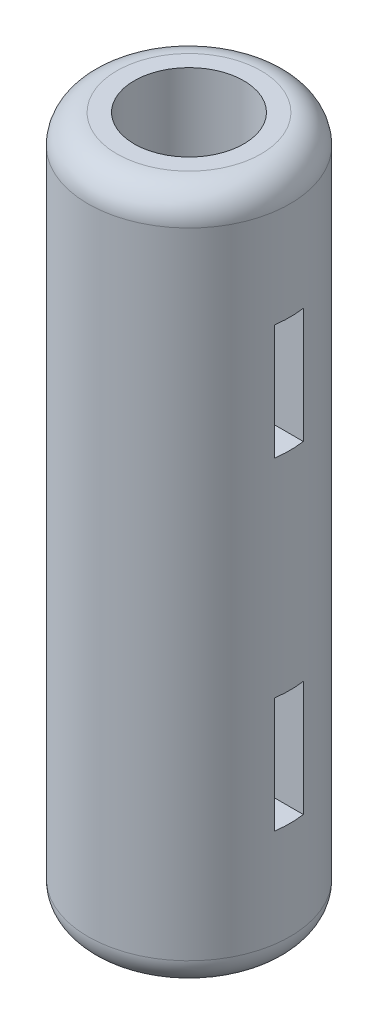
ISO-10303-21;
HEADER;
FILE_DESCRIPTION(('STEP AP214'),'2;1');
FILE_NAME('part.step','',(''),(''),'','','');
FILE_SCHEMA(('AUTOMOTIVE_DESIGN { 1 0 10303 214 1 1 1 1 }'));
ENDSEC;
DATA;
#1=APPLICATION_CONTEXT('core data for automotive mechanical design processes');
#2=APPLICATION_PROTOCOL_DEFINITION('international standard','automotive_design',2000,#1);
#3=PRODUCT_CONTEXT('',#1,'mechanical');
#4=PRODUCT('Part','Part','',(#3));
#5=PRODUCT_RELATED_PRODUCT_CATEGORY('part','',(#4));
#6=PRODUCT_DEFINITION_FORMATION('','',#4);
#7=PRODUCT_DEFINITION_CONTEXT('part definition',#1,'design');
#8=PRODUCT_DEFINITION('design','',#6,#7);
#9=PRODUCT_DEFINITION_SHAPE('','',#8);
#10=(LENGTH_UNIT() NAMED_UNIT(*) SI_UNIT(.MILLI.,.METRE.));
#11=(NAMED_UNIT(*) PLANE_ANGLE_UNIT() SI_UNIT($,.RADIAN.));
#12=(NAMED_UNIT(*) SI_UNIT($,.STERADIAN.) SOLID_ANGLE_UNIT());
#13=UNCERTAINTY_MEASURE_WITH_UNIT(LENGTH_MEASURE(1.E-05),#10,'distance_accuracy_value','');
#14=(GEOMETRIC_REPRESENTATION_CONTEXT(3) GLOBAL_UNCERTAINTY_ASSIGNED_CONTEXT((#13)) GLOBAL_UNIT_ASSIGNED_CONTEXT((#10,
#11,#12)) REPRESENTATION_CONTEXT('',''));
#15=CARTESIAN_POINT('',(0.,0.,0.));
#16=DIRECTION('',(0.,0.,1.));
#17=DIRECTION('',(1.,0.,0.));
#18=AXIS2_PLACEMENT_3D('',#15,#16,#17);
#19=CARTESIAN_POINT('',(0.,240.,0.));
#20=DIRECTION('',(0.,-1.,0.));
#21=DIRECTION('',(0.,0.,-1.));
#22=AXIS2_PLACEMENT_3D('',#19,#20,#21);
#23=CYLINDRICAL_SURFACE('',#22,35.);
#24=CARTESIAN_POINT('',(0.,10.,0.));
#25=DIRECTION('',(0.,1.,0.));
#26=DIRECTION('',(0.,0.,1.));
#27=AXIS2_PLACEMENT_3D('',#24,#25,#26);
#28=CIRCLE('',#27,35.);
#29=CARTESIAN_POINT('',(0.,10.,35.));
#30=VERTEX_POINT('',#29);
#31=EDGE_CURVE('E48',#30,#30,#28,.T.);
#32=ORIENTED_EDGE('',*,*,#31,.T.);
#33=EDGE_LOOP('',(#32));
#34=FACE_BOUND('',#33,.T.);
#35=CARTESIAN_POINT('',(0.,230.,0.));
#36=DIRECTION('',(0.,1.,0.));
#37=DIRECTION('',(0.,0.,1.));
#38=AXIS2_PLACEMENT_3D('',#35,#36,#37);
#39=CIRCLE('',#38,35.);
#40=CARTESIAN_POINT('',(0.,230.,35.));
#41=VERTEX_POINT('',#40);
#42=EDGE_CURVE('E196',#41,#41,#39,.F.);
#43=ORIENTED_EDGE('',*,*,#42,.T.);
#44=EDGE_LOOP('',(#43));
#45=FACE_BOUND('',#44,.T.);
#46=DIRECTION('',(0.,-1.,0.));
#47=VECTOR('',#46,1.);
#48=CARTESIAN_POINT('',(-34.6410161513776,240.,-4.99999999999993));
#49=LINE('',#48,#47);
#50=CARTESIAN_POINT('',(-34.6410161513776,44.,-4.99999999999999));
#51=VERTEX_POINT('',#50);
#52=CARTESIAN_POINT('',(-34.6410161513776,84.,-4.99999999999998));
#53=VERTEX_POINT('',#52);
#54=EDGE_CURVE('E294',#51,#53,#49,.F.);
#55=ORIENTED_EDGE('',*,*,#54,.T.);
#56=CARTESIAN_POINT('',(0.,84.,0.));
#57=DIRECTION('',(0.,1.,0.));
#58=DIRECTION('',(0.,0.,1.));
#59=AXIS2_PLACEMENT_3D('',#56,#57,#58);
#60=CIRCLE('',#59,35.);
#61=CARTESIAN_POINT('',(-34.6410161513776,84.,5.00000000000002));
#62=VERTEX_POINT('',#61);
#63=EDGE_CURVE('E55',#53,#62,#60,.T.);
#64=ORIENTED_EDGE('',*,*,#63,.T.);
#65=DIRECTION('',(0.,-1.,0.));
#66=VECTOR('',#65,1.);
#67=CARTESIAN_POINT('',(-34.6410161513775,240.,5.00000000000007));
#68=LINE('',#67,#66);
#69=CARTESIAN_POINT('',(-34.6410161513775,44.,5.00000000000001));
#70=VERTEX_POINT('',#69);
#71=EDGE_CURVE('E173',#62,#70,#68,.T.);
#72=ORIENTED_EDGE('',*,*,#71,.T.);
#73=CARTESIAN_POINT('',(0.,44.,0.));
#74=DIRECTION('',(0.,-1.,0.));
#75=DIRECTION('',(0.,0.,-1.));
#76=AXIS2_PLACEMENT_3D('',#73,#74,#75);
#77=CIRCLE('',#76,35.);
#78=EDGE_CURVE('E277',#70,#51,#77,.T.);
#79=ORIENTED_EDGE('',*,*,#78,.T.);
#80=EDGE_LOOP('',(#55,#64,#72,#79));
#81=FACE_BOUND('',#80,.T.);
#82=DIRECTION('',(0.,-1.,0.));
#83=VECTOR('',#82,1.);
#84=CARTESIAN_POINT('',(34.6410161513775,240.,5.00000000000007));
#85=LINE('',#84,#83);
#86=CARTESIAN_POINT('',(34.6410161513775,44.,5.00000000000001));
#87=VERTEX_POINT('',#86);
#88=CARTESIAN_POINT('',(34.6410161513776,84.,5.00000000000002));
#89=VERTEX_POINT('',#88);
#90=EDGE_CURVE('E289',#87,#89,#85,.F.);
#91=ORIENTED_EDGE('',*,*,#90,.T.);
#92=CARTESIAN_POINT('',(34.6410161513776,84.,-4.99999999999998));
#93=VERTEX_POINT('',#92);
#94=EDGE_CURVE('E63',#89,#93,#60,.T.);
#95=ORIENTED_EDGE('',*,*,#94,.T.);
#96=DIRECTION('',(0.,-1.,0.));
#97=VECTOR('',#96,1.);
#98=CARTESIAN_POINT('',(34.6410161513776,240.,-4.99999999999993));
#99=LINE('',#98,#97);
#100=CARTESIAN_POINT('',(34.6410161513776,44.,-4.99999999999999));
#101=VERTEX_POINT('',#100);
#102=EDGE_CURVE('E296',#93,#101,#99,.T.);
#103=ORIENTED_EDGE('',*,*,#102,.T.);
#104=EDGE_CURVE('E292',#101,#87,#77,.T.);
#105=ORIENTED_EDGE('',*,*,#104,.T.);
#106=EDGE_LOOP('',(#91,#95,#103,#105));
#107=FACE_BOUND('',#106,.T.);
#108=DIRECTION('',(0.,-1.,0.));
#109=VECTOR('',#108,1.);
#110=CARTESIAN_POINT('',(-34.6410161513776,240.,4.99999999999999));
#111=LINE('',#110,#109);
#112=CARTESIAN_POINT('',(-34.6410161513776,156.,4.99999999999999));
#113=VERTEX_POINT('',#112);
#114=CARTESIAN_POINT('',(-34.6410161513776,196.,4.99999999999999));
#115=VERTEX_POINT('',#114);
#116=EDGE_CURVE('E322',#113,#115,#111,.F.);
#117=ORIENTED_EDGE('',*,*,#116,.F.);
#118=CARTESIAN_POINT('',(0.,156.,0.));
#119=DIRECTION('',(0.,-1.,0.));
#120=DIRECTION('',(0.,0.,-1.));
#121=AXIS2_PLACEMENT_3D('',#118,#119,#120);
#122=CIRCLE('',#121,35.);
#123=CARTESIAN_POINT('',(-34.6410161513776,156.,-5.00000000000001));
#124=VERTEX_POINT('',#123);
#125=EDGE_CURVE('E327',#113,#124,#122,.T.);
#126=ORIENTED_EDGE('',*,*,#125,.T.);
#127=DIRECTION('',(0.,-1.,0.));
#128=VECTOR('',#127,1.);
#129=CARTESIAN_POINT('',(-34.6410161513776,240.,-5.00000000000001));
#130=LINE('',#129,#128);
#131=CARTESIAN_POINT('',(-34.6410161513776,196.,-5.00000000000001));
#132=VERTEX_POINT('',#131);
#133=EDGE_CURVE('E313',#124,#132,#130,.F.);
#134=ORIENTED_EDGE('',*,*,#133,.T.);
#135=CARTESIAN_POINT('',(0.,196.,0.));
#136=DIRECTION('',(0.,-1.,0.));
#137=DIRECTION('',(0.,0.,-1.));
#138=AXIS2_PLACEMENT_3D('',#135,#136,#137);
#139=CIRCLE('',#138,35.);
#140=EDGE_CURVE('E319',#115,#132,#139,.T.);
#141=ORIENTED_EDGE('',*,*,#140,.F.);
#142=EDGE_LOOP('',(#117,#126,#134,#141));
#143=FACE_BOUND('',#142,.T.);
#144=CARTESIAN_POINT('',(34.6410161513776,196.,-5.00000000000001));
#145=VERTEX_POINT('',#144);
#146=CARTESIAN_POINT('',(34.6410161513776,196.,4.99999999999999));
#147=VERTEX_POINT('',#146);
#148=EDGE_CURVE('E320',#145,#147,#139,.T.);
#149=ORIENTED_EDGE('',*,*,#148,.F.);
#150=DIRECTION('',(0.,-1.,0.));
#151=VECTOR('',#150,1.);
#152=CARTESIAN_POINT('',(34.6410161513776,240.,-5.00000000000001));
#153=LINE('',#152,#151);
#154=CARTESIAN_POINT('',(34.6410161513776,156.,-5.00000000000001));
#155=VERTEX_POINT('',#154);
#156=EDGE_CURVE('E316',#145,#155,#153,.T.);
#157=ORIENTED_EDGE('',*,*,#156,.T.);
#158=CARTESIAN_POINT('',(34.6410161513776,156.,4.99999999999999));
#159=VERTEX_POINT('',#158);
#160=EDGE_CURVE('E328',#155,#159,#122,.T.);
#161=ORIENTED_EDGE('',*,*,#160,.T.);
#162=DIRECTION('',(0.,-1.,0.));
#163=VECTOR('',#162,1.);
#164=CARTESIAN_POINT('',(34.6410161513776,240.,4.99999999999999));
#165=LINE('',#164,#163);
#166=EDGE_CURVE('E324',#147,#159,#165,.T.);
#167=ORIENTED_EDGE('',*,*,#166,.F.);
#168=EDGE_LOOP('',(#149,#157,#161,#167));
#169=FACE_BOUND('',#168,.T.);
#170=ADVANCED_FACE('F40',(#34,#45,#81,#107,#143,#169),#23,.T.);
#171=CARTESIAN_POINT('',(0.,240.,0.));
#172=DIRECTION('',(0.,1.,0.));
#173=DIRECTION('',(0.,0.,1.));
#174=AXIS2_PLACEMENT_3D('',#171,#172,#173);
#175=PLANE('',#174);
#176=CARTESIAN_POINT('',(0.,240.,0.));
#177=DIRECTION('',(0.,1.,0.));
#178=DIRECTION('',(0.,0.,1.));
#179=AXIS2_PLACEMENT_3D('',#176,#177,#178);
#180=CIRCLE('',#179,25.);
#181=CARTESIAN_POINT('',(0.,240.,25.));
#182=VERTEX_POINT('',#181);
#183=EDGE_CURVE('E193',#182,#182,#180,.T.);
#184=ORIENTED_EDGE('',*,*,#183,.T.);
#185=EDGE_LOOP('',(#184));
#186=FACE_BOUND('',#185,.T.);
#187=CARTESIAN_POINT('',(0.,240.,0.));
#188=DIRECTION('',(0.,1.,0.));
#189=DIRECTION('',(0.,0.,1.));
#190=AXIS2_PLACEMENT_3D('',#187,#188,#189);
#191=CIRCLE('',#190,19.);
#192=CARTESIAN_POINT('',(0.,240.,19.));
#193=VERTEX_POINT('',#192);
#194=EDGE_CURVE('E331',#193,#193,#191,.T.);
#195=ORIENTED_EDGE('',*,*,#194,.F.);
#196=EDGE_LOOP('',(#195));
#197=FACE_BOUND('',#196,.T.);
#198=ADVANCED_FACE('F214',(#186,#197),#175,.T.);
#199=CARTESIAN_POINT('',(0.,0.,0.));
#200=DIRECTION('',(0.,1.,0.));
#201=DIRECTION('',(0.,0.,1.));
#202=AXIS2_PLACEMENT_3D('',#199,#200,#201);
#203=PLANE('',#202);
#204=CARTESIAN_POINT('',(0.,0.,0.));
#205=DIRECTION('',(0.,1.,0.));
#206=DIRECTION('',(0.,0.,1.));
#207=AXIS2_PLACEMENT_3D('',#204,#205,#206);
#208=CIRCLE('',#207,25.);
#209=CARTESIAN_POINT('',(0.,0.,25.));
#210=VERTEX_POINT('',#209);
#211=EDGE_CURVE('E12',#210,#210,#208,.F.);
#212=ORIENTED_EDGE('',*,*,#211,.T.);
#213=EDGE_LOOP('',(#212));
#214=FACE_BOUND('',#213,.T.);
#215=CARTESIAN_POINT('',(0.,0.,0.));
#216=DIRECTION('',(0.,1.,0.));
#217=DIRECTION('',(0.,0.,1.));
#218=AXIS2_PLACEMENT_3D('',#215,#216,#217);
#219=CIRCLE('',#218,19.);
#220=CARTESIAN_POINT('',(0.,0.,19.));
#221=VERTEX_POINT('',#220);
#222=EDGE_CURVE('E330',#221,#221,#219,.T.);
#223=ORIENTED_EDGE('',*,*,#222,.T.);
#224=EDGE_LOOP('',(#223));
#225=FACE_BOUND('',#224,.T.);
#226=ADVANCED_FACE('F219',(#214,#225),#203,.F.);
#227=CARTESIAN_POINT('',(0.,240.,0.));
#228=DIRECTION('',(0.,-1.,0.));
#229=DIRECTION('',(0.,0.,-1.));
#230=AXIS2_PLACEMENT_3D('',#227,#228,#229);
#231=CYLINDRICAL_SURFACE('',#230,19.);
#232=DIRECTION('',(0.,-1.,0.));
#233=VECTOR('',#232,1.);
#234=CARTESIAN_POINT('',(18.3303027798234,240.,-4.99999999999993));
#235=LINE('',#234,#233);
#236=CARTESIAN_POINT('',(18.3303027798234,84.,-4.99999999999998));
#237=VERTEX_POINT('',#236);
#238=CARTESIAN_POINT('',(18.3303027798234,44.,-4.99999999999999));
#239=VERTEX_POINT('',#238);
#240=EDGE_CURVE('E191',#237,#239,#235,.T.);
#241=ORIENTED_EDGE('',*,*,#240,.F.);
#242=CARTESIAN_POINT('',(0.,84.,0.));
#243=DIRECTION('',(0.,1.,0.));
#244=DIRECTION('',(0.,0.,1.));
#245=AXIS2_PLACEMENT_3D('',#242,#243,#244);
#246=CIRCLE('',#245,19.);
#247=CARTESIAN_POINT('',(18.3303027798234,84.,5.00000000000002));
#248=VERTEX_POINT('',#247);
#249=EDGE_CURVE('E168',#248,#237,#246,.T.);
#250=ORIENTED_EDGE('',*,*,#249,.F.);
#251=DIRECTION('',(0.,-1.,0.));
#252=VECTOR('',#251,1.);
#253=CARTESIAN_POINT('',(18.3303027798233,240.,5.00000000000007));
#254=LINE('',#253,#252);
#255=CARTESIAN_POINT('',(18.3303027798233,44.,5.00000000000001));
#256=VERTEX_POINT('',#255);
#257=EDGE_CURVE('E188',#256,#248,#254,.F.);
#258=ORIENTED_EDGE('',*,*,#257,.F.);
#259=CARTESIAN_POINT('',(0.,44.,0.));
#260=DIRECTION('',(0.,-1.,0.));
#261=DIRECTION('',(0.,0.,-1.));
#262=AXIS2_PLACEMENT_3D('',#259,#260,#261);
#263=CIRCLE('',#262,19.);
#264=EDGE_CURVE('E184',#239,#256,#263,.T.);
#265=ORIENTED_EDGE('',*,*,#264,.F.);
#266=EDGE_LOOP('',(#241,#250,#258,#265));
#267=FACE_BOUND('',#266,.T.);
#268=DIRECTION('',(0.,-1.,0.));
#269=VECTOR('',#268,1.);
#270=CARTESIAN_POINT('',(-18.3303027798234,240.,-4.99999999999993));
#271=LINE('',#270,#269);
#272=CARTESIAN_POINT('',(-18.3303027798234,44.,-4.99999999999999));
#273=VERTEX_POINT('',#272);
#274=CARTESIAN_POINT('',(-18.3303027798234,84.,-4.99999999999998));
#275=VERTEX_POINT('',#274);
#276=EDGE_CURVE('E182',#273,#275,#271,.F.);
#277=ORIENTED_EDGE('',*,*,#276,.F.);
#278=CARTESIAN_POINT('',(-18.3303027798233,44.,5.00000000000001));
#279=VERTEX_POINT('',#278);
#280=EDGE_CURVE('E180',#279,#273,#263,.T.);
#281=ORIENTED_EDGE('',*,*,#280,.F.);
#282=DIRECTION('',(0.,-1.,0.));
#283=VECTOR('',#282,1.);
#284=CARTESIAN_POINT('',(-18.3303027798233,240.,5.00000000000007));
#285=LINE('',#284,#283);
#286=CARTESIAN_POINT('',(-18.3303027798234,84.,5.00000000000002));
#287=VERTEX_POINT('',#286);
#288=EDGE_CURVE('E165',#287,#279,#285,.T.);
#289=ORIENTED_EDGE('',*,*,#288,.F.);
#290=EDGE_CURVE('E154',#275,#287,#246,.T.);
#291=ORIENTED_EDGE('',*,*,#290,.F.);
#292=EDGE_LOOP('',(#277,#281,#289,#291));
#293=FACE_BOUND('',#292,.T.);
#294=CARTESIAN_POINT('',(0.,156.,0.));
#295=DIRECTION('',(0.,-1.,0.));
#296=DIRECTION('',(0.,0.,-1.));
#297=AXIS2_PLACEMENT_3D('',#294,#295,#296);
#298=CIRCLE('',#297,19.);
#299=CARTESIAN_POINT('',(18.3303027798234,156.,-5.00000000000001));
#300=VERTEX_POINT('',#299);
#301=CARTESIAN_POINT('',(18.3303027798234,156.,4.99999999999999));
#302=VERTEX_POINT('',#301);
#303=EDGE_CURVE('E166',#300,#302,#298,.T.);
#304=ORIENTED_EDGE('',*,*,#303,.F.);
#305=DIRECTION('',(0.,-1.,0.));
#306=VECTOR('',#305,1.);
#307=CARTESIAN_POINT('',(18.3303027798234,240.,-5.00000000000001));
#308=LINE('',#307,#306);
#309=CARTESIAN_POINT('',(18.3303027798234,196.,-5.00000000000001));
#310=VERTEX_POINT('',#309);
#311=EDGE_CURVE('E348',#310,#300,#308,.T.);
#312=ORIENTED_EDGE('',*,*,#311,.F.);
#313=CARTESIAN_POINT('',(0.,196.,0.));
#314=DIRECTION('',(0.,-1.,0.));
#315=DIRECTION('',(0.,0.,-1.));
#316=AXIS2_PLACEMENT_3D('',#313,#314,#315);
#317=CIRCLE('',#316,19.);
#318=CARTESIAN_POINT('',(18.3303027798234,196.,4.99999999999999));
#319=VERTEX_POINT('',#318);
#320=EDGE_CURVE('E342',#310,#319,#317,.T.);
#321=ORIENTED_EDGE('',*,*,#320,.T.);
#322=DIRECTION('',(0.,-1.,0.));
#323=VECTOR('',#322,1.);
#324=CARTESIAN_POINT('',(18.3303027798234,240.,4.99999999999999));
#325=LINE('',#324,#323);
#326=EDGE_CURVE('E349',#319,#302,#325,.T.);
#327=ORIENTED_EDGE('',*,*,#326,.T.);
#328=EDGE_LOOP('',(#304,#312,#321,#327));
#329=FACE_BOUND('',#328,.T.);
#330=CARTESIAN_POINT('',(-18.3303027798234,156.,4.99999999999999));
#331=VERTEX_POINT('',#330);
#332=CARTESIAN_POINT('',(-18.3303027798234,156.,-5.00000000000001));
#333=VERTEX_POINT('',#332);
#334=EDGE_CURVE('E345',#331,#333,#298,.T.);
#335=ORIENTED_EDGE('',*,*,#334,.F.);
#336=DIRECTION('',(0.,-1.,0.));
#337=VECTOR('',#336,1.);
#338=CARTESIAN_POINT('',(-18.3303027798234,240.,4.99999999999999));
#339=LINE('',#338,#337);
#340=CARTESIAN_POINT('',(-18.3303027798234,196.,4.99999999999999));
#341=VERTEX_POINT('',#340);
#342=EDGE_CURVE('E341',#331,#341,#339,.F.);
#343=ORIENTED_EDGE('',*,*,#342,.T.);
#344=CARTESIAN_POINT('',(-18.3303027798234,196.,-5.00000000000001));
#345=VERTEX_POINT('',#344);
#346=EDGE_CURVE('E338',#341,#345,#317,.T.);
#347=ORIENTED_EDGE('',*,*,#346,.T.);
#348=DIRECTION('',(0.,-1.,0.));
#349=VECTOR('',#348,1.);
#350=CARTESIAN_POINT('',(-18.3303027798234,240.,-5.00000000000001));
#351=LINE('',#350,#349);
#352=EDGE_CURVE('E334',#333,#345,#351,.F.);
#353=ORIENTED_EDGE('',*,*,#352,.F.);
#354=EDGE_LOOP('',(#335,#343,#347,#353));
#355=FACE_BOUND('',#354,.T.);
#356=ORIENTED_EDGE('',*,*,#194,.T.);
#357=EDGE_LOOP('',(#356));
#358=FACE_BOUND('',#357,.T.);
#359=ORIENTED_EDGE('',*,*,#222,.F.);
#360=EDGE_LOOP('',(#359));
#361=FACE_BOUND('',#360,.T.);
#362=ADVANCED_FACE('F178',(#267,#293,#329,#355,#358,#361),#231,.F.);
#363=CARTESIAN_POINT('',(-35.,156.,-5.00000000000001));
#364=DIRECTION('',(0.,0.,-1.));
#365=DIRECTION('',(-1.,0.,0.));
#366=AXIS2_PLACEMENT_3D('',#363,#364,#365);
#367=PLANE('',#366);
#368=DIRECTION('',(1.,0.,0.));
#369=VECTOR('',#368,1.);
#370=CARTESIAN_POINT('',(-35.,156.,-5.00000000000001));
#371=LINE('',#370,#369);
#372=EDGE_CURVE('E311',#124,#333,#371,.T.);
#373=ORIENTED_EDGE('',*,*,#372,.T.);
#374=ORIENTED_EDGE('',*,*,#352,.T.);
#375=DIRECTION('',(1.,0.,0.));
#376=VECTOR('',#375,1.);
#377=CARTESIAN_POINT('',(-35.,196.,-5.00000000000001));
#378=LINE('',#377,#376);
#379=EDGE_CURVE('E307',#132,#345,#378,.T.);
#380=ORIENTED_EDGE('',*,*,#379,.F.);
#381=ORIENTED_EDGE('',*,*,#133,.F.);
#382=EDGE_LOOP('',(#373,#374,#380,#381));
#383=FACE_BOUND('',#382,.T.);
#384=ADVANCED_FACE('F227',(#383),#367,.F.);
#385=CARTESIAN_POINT('',(-35.,196.,4.99999999999999));
#386=DIRECTION('',(0.,-1.,0.));
#387=DIRECTION('',(0.,0.,-1.));
#388=AXIS2_PLACEMENT_3D('',#385,#386,#387);
#389=PLANE('',#388);
#390=ORIENTED_EDGE('',*,*,#140,.T.);
#391=ORIENTED_EDGE('',*,*,#379,.T.);
#392=ORIENTED_EDGE('',*,*,#346,.F.);
#393=DIRECTION('',(1.,0.,0.));
#394=VECTOR('',#393,1.);
#395=CARTESIAN_POINT('',(-35.,196.,4.99999999999999));
#396=LINE('',#395,#394);
#397=EDGE_CURVE('E303',#115,#341,#396,.T.);
#398=ORIENTED_EDGE('',*,*,#397,.F.);
#399=EDGE_LOOP('',(#390,#391,#392,#398));
#400=FACE_BOUND('',#399,.T.);
#401=ADVANCED_FACE('F243',(#400),#389,.T.);
#402=CARTESIAN_POINT('',(-35.,156.,4.99999999999999));
#403=DIRECTION('',(0.,0.,-1.));
#404=DIRECTION('',(-1.,0.,0.));
#405=AXIS2_PLACEMENT_3D('',#402,#403,#404);
#406=PLANE('',#405);
#407=ORIENTED_EDGE('',*,*,#116,.T.);
#408=ORIENTED_EDGE('',*,*,#397,.T.);
#409=ORIENTED_EDGE('',*,*,#342,.F.);
#410=DIRECTION('',(1.,0.,0.));
#411=VECTOR('',#410,1.);
#412=CARTESIAN_POINT('',(-35.,156.,4.99999999999999));
#413=LINE('',#412,#411);
#414=EDGE_CURVE('E302',#113,#331,#413,.T.);
#415=ORIENTED_EDGE('',*,*,#414,.F.);
#416=EDGE_LOOP('',(#407,#408,#409,#415));
#417=FACE_BOUND('',#416,.T.);
#418=ADVANCED_FACE('F247',(#417),#406,.T.);
#419=CARTESIAN_POINT('',(-35.,156.,4.99999999999999));
#420=DIRECTION('',(0.,-1.,0.));
#421=DIRECTION('',(0.,0.,-1.));
#422=AXIS2_PLACEMENT_3D('',#419,#420,#421);
#423=PLANE('',#422);
#424=ORIENTED_EDGE('',*,*,#414,.T.);
#425=ORIENTED_EDGE('',*,*,#334,.T.);
#426=ORIENTED_EDGE('',*,*,#372,.F.);
#427=ORIENTED_EDGE('',*,*,#125,.F.);
#428=EDGE_LOOP('',(#424,#425,#426,#427));
#429=FACE_BOUND('',#428,.T.);
#430=ADVANCED_FACE('F233',(#429),#423,.F.);
#431=EDGE_CURVE('E298',#300,#155,#371,.T.);
#432=ORIENTED_EDGE('',*,*,#431,.F.);
#433=ORIENTED_EDGE('',*,*,#303,.T.);
#434=EDGE_CURVE('E299',#302,#159,#413,.T.);
#435=ORIENTED_EDGE('',*,*,#434,.T.);
#436=ORIENTED_EDGE('',*,*,#160,.F.);
#437=EDGE_LOOP('',(#432,#433,#435,#436));
#438=FACE_BOUND('',#437,.T.);
#439=ADVANCED_FACE('F229',(#438),#423,.F.);
#440=ORIENTED_EDGE('',*,*,#166,.T.);
#441=ORIENTED_EDGE('',*,*,#434,.F.);
#442=ORIENTED_EDGE('',*,*,#326,.F.);
#443=EDGE_CURVE('E304',#319,#147,#396,.T.);
#444=ORIENTED_EDGE('',*,*,#443,.T.);
#445=EDGE_LOOP('',(#440,#441,#442,#444));
#446=FACE_BOUND('',#445,.T.);
#447=ADVANCED_FACE('F232',(#446),#406,.T.);
#448=ORIENTED_EDGE('',*,*,#148,.T.);
#449=ORIENTED_EDGE('',*,*,#443,.F.);
#450=ORIENTED_EDGE('',*,*,#320,.F.);
#451=EDGE_CURVE('E308',#310,#145,#378,.T.);
#452=ORIENTED_EDGE('',*,*,#451,.T.);
#453=EDGE_LOOP('',(#448,#449,#450,#452));
#454=FACE_BOUND('',#453,.T.);
#455=ADVANCED_FACE('F238',(#454),#389,.T.);
#456=ORIENTED_EDGE('',*,*,#451,.F.);
#457=ORIENTED_EDGE('',*,*,#311,.T.);
#458=ORIENTED_EDGE('',*,*,#431,.T.);
#459=ORIENTED_EDGE('',*,*,#156,.F.);
#460=EDGE_LOOP('',(#456,#457,#458,#459));
#461=FACE_BOUND('',#460,.T.);
#462=ADVANCED_FACE('F235',(#461),#367,.F.);
#463=CARTESIAN_POINT('',(-35.,84.,5.00000000000002));
#464=DIRECTION('',(0.,1.,0.));
#465=DIRECTION('',(0.,0.,1.));
#466=AXIS2_PLACEMENT_3D('',#463,#464,#465);
#467=PLANE('',#466);
#468=DIRECTION('',(1.,0.,0.));
#469=VECTOR('',#468,1.);
#470=CARTESIAN_POINT('',(-35.,84.,-4.99999999999998));
#471=LINE('',#470,#469);
#472=EDGE_CURVE('E160',#53,#275,#471,.T.);
#473=ORIENTED_EDGE('',*,*,#472,.T.);
#474=ORIENTED_EDGE('',*,*,#290,.T.);
#475=DIRECTION('',(1.,0.,0.));
#476=VECTOR('',#475,1.);
#477=CARTESIAN_POINT('',(-35.,84.,5.00000000000002));
#478=LINE('',#477,#476);
#479=EDGE_CURVE('E157',#62,#287,#478,.T.);
#480=ORIENTED_EDGE('',*,*,#479,.F.);
#481=ORIENTED_EDGE('',*,*,#63,.F.);
#482=EDGE_LOOP('',(#473,#474,#480,#481));
#483=FACE_BOUND('',#482,.T.);
#484=ADVANCED_FACE('F156',(#483),#467,.F.);
#485=CARTESIAN_POINT('',(-35.,84.,5.00000000000002));
#486=DIRECTION('',(0.,0.,1.));
#487=DIRECTION('',(0.,-1.,0.));
#488=AXIS2_PLACEMENT_3D('',#485,#486,#487);
#489=PLANE('',#488);
#490=ORIENTED_EDGE('',*,*,#479,.T.);
#491=ORIENTED_EDGE('',*,*,#288,.T.);
#492=DIRECTION('',(1.,0.,0.));
#493=VECTOR('',#492,1.);
#494=CARTESIAN_POINT('',(-35.,44.,5.00000000000001));
#495=LINE('',#494,#493);
#496=EDGE_CURVE('E274',#70,#279,#495,.T.);
#497=ORIENTED_EDGE('',*,*,#496,.F.);
#498=ORIENTED_EDGE('',*,*,#71,.F.);
#499=EDGE_LOOP('',(#490,#491,#497,#498));
#500=FACE_BOUND('',#499,.T.);
#501=ADVANCED_FACE('F170',(#500),#489,.F.);
#502=CARTESIAN_POINT('',(-35.,44.,5.00000000000001));
#503=DIRECTION('',(0.,-1.,0.));
#504=DIRECTION('',(0.,0.,-1.));
#505=AXIS2_PLACEMENT_3D('',#502,#503,#504);
#506=PLANE('',#505);
#507=ORIENTED_EDGE('',*,*,#496,.T.);
#508=ORIENTED_EDGE('',*,*,#280,.T.);
#509=DIRECTION('',(1.,0.,0.));
#510=VECTOR('',#509,1.);
#511=CARTESIAN_POINT('',(-35.,44.,-4.99999999999999));
#512=LINE('',#511,#510);
#513=EDGE_CURVE('E281',#51,#273,#512,.T.);
#514=ORIENTED_EDGE('',*,*,#513,.F.);
#515=ORIENTED_EDGE('',*,*,#78,.F.);
#516=EDGE_LOOP('',(#507,#508,#514,#515));
#517=FACE_BOUND('',#516,.T.);
#518=ADVANCED_FACE('F260',(#517),#506,.F.);
#519=CARTESIAN_POINT('',(-35.,84.,-4.99999999999998));
#520=DIRECTION('',(0.,0.,-1.));
#521=DIRECTION('',(0.,1.,0.));
#522=AXIS2_PLACEMENT_3D('',#519,#520,#521);
#523=PLANE('',#522);
#524=ORIENTED_EDGE('',*,*,#513,.T.);
#525=ORIENTED_EDGE('',*,*,#276,.T.);
#526=ORIENTED_EDGE('',*,*,#472,.F.);
#527=ORIENTED_EDGE('',*,*,#54,.F.);
#528=EDGE_LOOP('',(#524,#525,#526,#527));
#529=FACE_BOUND('',#528,.T.);
#530=ADVANCED_FACE('F252',(#529),#523,.F.);
#531=EDGE_CURVE('E286',#237,#93,#471,.T.);
#532=ORIENTED_EDGE('',*,*,#531,.F.);
#533=ORIENTED_EDGE('',*,*,#240,.T.);
#534=EDGE_CURVE('E278',#239,#101,#512,.T.);
#535=ORIENTED_EDGE('',*,*,#534,.T.);
#536=ORIENTED_EDGE('',*,*,#102,.F.);
#537=EDGE_LOOP('',(#532,#533,#535,#536));
#538=FACE_BOUND('',#537,.T.);
#539=ADVANCED_FACE('F248',(#538),#523,.F.);
#540=ORIENTED_EDGE('',*,*,#534,.F.);
#541=ORIENTED_EDGE('',*,*,#264,.T.);
#542=EDGE_CURVE('E174',#256,#87,#495,.T.);
#543=ORIENTED_EDGE('',*,*,#542,.T.);
#544=ORIENTED_EDGE('',*,*,#104,.F.);
#545=EDGE_LOOP('',(#540,#541,#543,#544));
#546=FACE_BOUND('',#545,.T.);
#547=ADVANCED_FACE('F251',(#546),#506,.F.);
#548=ORIENTED_EDGE('',*,*,#542,.F.);
#549=ORIENTED_EDGE('',*,*,#257,.T.);
#550=EDGE_CURVE('E175',#248,#89,#478,.T.);
#551=ORIENTED_EDGE('',*,*,#550,.T.);
#552=ORIENTED_EDGE('',*,*,#90,.F.);
#553=EDGE_LOOP('',(#548,#549,#551,#552));
#554=FACE_BOUND('',#553,.T.);
#555=ADVANCED_FACE('F256',(#554),#489,.F.);
#556=ORIENTED_EDGE('',*,*,#550,.F.);
#557=ORIENTED_EDGE('',*,*,#249,.T.);
#558=ORIENTED_EDGE('',*,*,#531,.T.);
#559=ORIENTED_EDGE('',*,*,#94,.F.);
#560=EDGE_LOOP('',(#556,#557,#558,#559));
#561=FACE_BOUND('',#560,.T.);
#562=ADVANCED_FACE('F210',(#561),#467,.F.);
#563=CARTESIAN_POINT('',(0.,230.,0.));
#564=DIRECTION('',(0.,1.,0.));
#565=DIRECTION('',(0.,0.,1.));
#566=AXIS2_PLACEMENT_3D('',#563,#564,#565);
#567=TOROIDAL_SURFACE('',#566,25.,10.);
#568=ORIENTED_EDGE('',*,*,#42,.F.);
#569=EDGE_LOOP('',(#568));
#570=FACE_BOUND('',#569,.T.);
#571=ORIENTED_EDGE('',*,*,#183,.F.);
#572=EDGE_LOOP('',(#571));
#573=FACE_BOUND('',#572,.T.);
#574=ADVANCED_FACE('F204',(#570,#573),#567,.T.);
#575=CARTESIAN_POINT('',(0.,10.,0.));
#576=DIRECTION('',(0.,1.,0.));
#577=DIRECTION('',(0.,0.,1.));
#578=AXIS2_PLACEMENT_3D('',#575,#576,#577);
#579=TOROIDAL_SURFACE('',#578,25.,10.);
#580=ORIENTED_EDGE('',*,*,#211,.F.);
#581=EDGE_LOOP('',(#580));
#582=FACE_BOUND('',#581,.T.);
#583=ORIENTED_EDGE('',*,*,#31,.F.);
#584=EDGE_LOOP('',(#583));
#585=FACE_BOUND('',#584,.T.);
#586=ADVANCED_FACE('F42',(#582,#585),#579,.T.);
#587=CLOSED_SHELL('',(#170,#198,#226,#362,#384,#401,#418,#430,#439,#447,#455,#462,#484,#501,
#518,#530,#539,#547,#555,#562,#574,#586));
#588=MANIFOLD_SOLID_BREP('B2',#587);
#589=ADVANCED_BREP_SHAPE_REPRESENTATION('',(#18,#588),#14);
#590=SHAPE_DEFINITION_REPRESENTATION(#9,#589);
ENDSEC;
END-ISO-10303-21;
